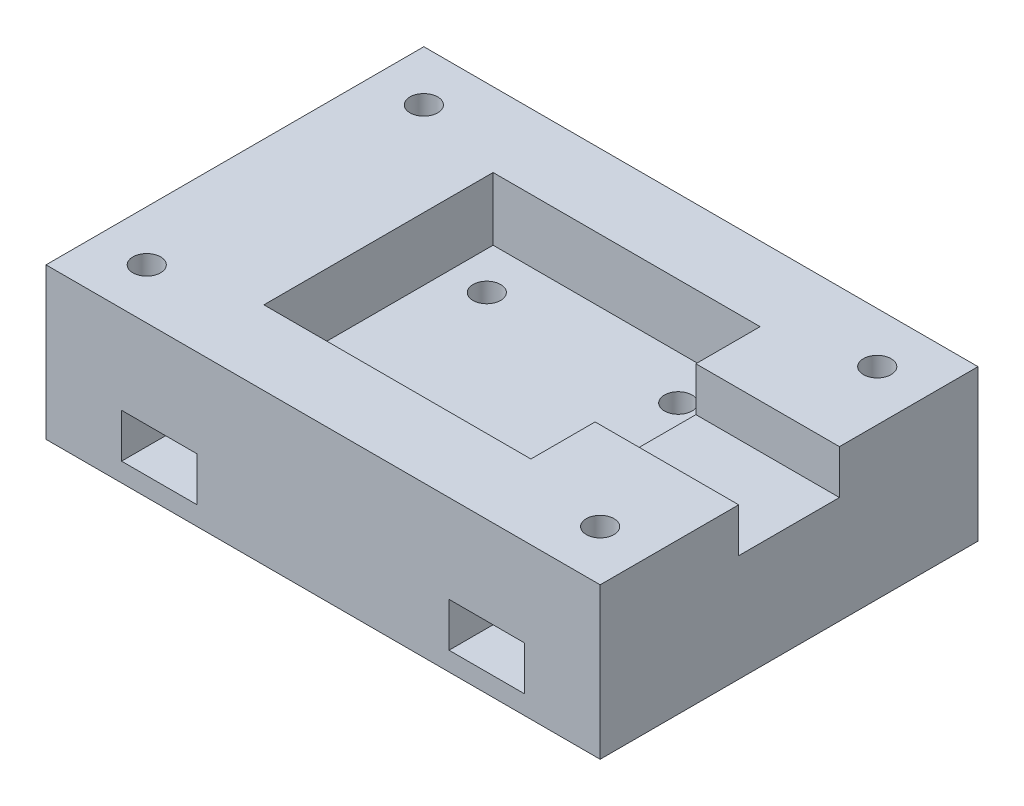
ISO-10303-21;
HEADER;
FILE_DESCRIPTION(('STEP AP214'),'2;1');
FILE_NAME('part.step','',(''),(''),'','','');
FILE_SCHEMA(('AUTOMOTIVE_DESIGN { 1 0 10303 214 1 1 1 1 }'));
ENDSEC;
DATA;
#1=APPLICATION_CONTEXT('core data for automotive mechanical design processes');
#2=APPLICATION_PROTOCOL_DEFINITION('international standard','automotive_design',2000,#1);
#3=PRODUCT_CONTEXT('',#1,'mechanical');
#4=PRODUCT('Part','Part','',(#3));
#5=PRODUCT_RELATED_PRODUCT_CATEGORY('part','',(#4));
#6=PRODUCT_DEFINITION_FORMATION('','',#4);
#7=PRODUCT_DEFINITION_CONTEXT('part definition',#1,'design');
#8=PRODUCT_DEFINITION('design','',#6,#7);
#9=PRODUCT_DEFINITION_SHAPE('','',#8);
#10=(LENGTH_UNIT() NAMED_UNIT(*) SI_UNIT(.MILLI.,.METRE.));
#11=(NAMED_UNIT(*) PLANE_ANGLE_UNIT() SI_UNIT($,.RADIAN.));
#12=(NAMED_UNIT(*) SI_UNIT($,.STERADIAN.) SOLID_ANGLE_UNIT());
#13=UNCERTAINTY_MEASURE_WITH_UNIT(LENGTH_MEASURE(1.E-05),#10,'distance_accuracy_value','');
#14=(GEOMETRIC_REPRESENTATION_CONTEXT(3) GLOBAL_UNCERTAINTY_ASSIGNED_CONTEXT((#13)) GLOBAL_UNIT_ASSIGNED_CONTEXT((#10,
#11,#12)) REPRESENTATION_CONTEXT('',''));
#15=CARTESIAN_POINT('',(0.,0.,0.));
#16=DIRECTION('',(0.,0.,1.));
#17=DIRECTION('',(1.,0.,0.));
#18=AXIS2_PLACEMENT_3D('',#15,#16,#17);
#19=CARTESIAN_POINT('',(22.,12.,15.));
#20=DIRECTION('',(-1.,0.,0.));
#21=DIRECTION('',(0.,0.,1.));
#22=AXIS2_PLACEMENT_3D('',#19,#20,#21);
#23=PLANE('',#22);
#24=DIRECTION('',(0.,0.,-1.));
#25=VECTOR('',#24,1.);
#26=CARTESIAN_POINT('',(22.,12.,15.));
#27=LINE('',#26,#25);
#28=CARTESIAN_POINT('',(22.,12.,-4.));
#29=VERTEX_POINT('',#28);
#30=CARTESIAN_POINT('',(22.,12.,-15.));
#31=VERTEX_POINT('',#30);
#32=EDGE_CURVE('E334',#29,#31,#27,.T.);
#33=ORIENTED_EDGE('',*,*,#32,.F.);
#34=DIRECTION('',(0.,-1.,0.));
#35=VECTOR('',#34,1.);
#36=CARTESIAN_POINT('',(22.,12.,-4.));
#37=LINE('',#36,#35);
#38=CARTESIAN_POINT('',(22.,8.5,-4.));
#39=VERTEX_POINT('',#38);
#40=EDGE_CURVE('E261',#29,#39,#37,.T.);
#41=ORIENTED_EDGE('',*,*,#40,.T.);
#42=DIRECTION('',(0.,0.,1.));
#43=VECTOR('',#42,1.);
#44=CARTESIAN_POINT('',(22.,8.5,15.));
#45=LINE('',#44,#43);
#46=CARTESIAN_POINT('',(22.,8.5,4.));
#47=VERTEX_POINT('',#46);
#48=EDGE_CURVE('E253',#39,#47,#45,.T.);
#49=ORIENTED_EDGE('',*,*,#48,.T.);
#50=DIRECTION('',(0.,1.,0.));
#51=VECTOR('',#50,1.);
#52=CARTESIAN_POINT('',(22.,12.,4.));
#53=LINE('',#52,#51);
#54=CARTESIAN_POINT('',(22.,12.,4.));
#55=VERTEX_POINT('',#54);
#56=EDGE_CURVE('E258',#47,#55,#53,.T.);
#57=ORIENTED_EDGE('',*,*,#56,.T.);
#58=CARTESIAN_POINT('',(22.,12.,15.));
#59=VERTEX_POINT('',#58);
#60=EDGE_CURVE('E330',#59,#55,#27,.T.);
#61=ORIENTED_EDGE('',*,*,#60,.F.);
#62=DIRECTION('',(0.,-1.,0.));
#63=VECTOR('',#62,1.);
#64=CARTESIAN_POINT('',(22.,12.,15.));
#65=LINE('',#64,#63);
#66=CARTESIAN_POINT('',(22.,0.,15.));
#67=VERTEX_POINT('',#66);
#68=EDGE_CURVE('E340',#59,#67,#65,.T.);
#69=ORIENTED_EDGE('',*,*,#68,.T.);
#70=DIRECTION('',(0.,0.,-1.));
#71=VECTOR('',#70,1.);
#72=CARTESIAN_POINT('',(22.,0.,15.));
#73=LINE('',#72,#71);
#74=CARTESIAN_POINT('',(22.,0.,-15.));
#75=VERTEX_POINT('',#74);
#76=EDGE_CURVE('E323',#67,#75,#73,.T.);
#77=ORIENTED_EDGE('',*,*,#76,.T.);
#78=DIRECTION('',(0.,-1.,0.));
#79=VECTOR('',#78,1.);
#80=CARTESIAN_POINT('',(22.,12.,-15.));
#81=LINE('',#80,#79);
#82=EDGE_CURVE('E357',#31,#75,#81,.T.);
#83=ORIENTED_EDGE('',*,*,#82,.F.);
#84=EDGE_LOOP('',(#33,#41,#49,#57,#61,#69,#77,#83));
#85=FACE_BOUND('',#84,.T.);
#86=ADVANCED_FACE('F41',(#85),#23,.F.);
#87=CARTESIAN_POINT('',(-22.,12.,-15.));
#88=DIRECTION('',(0.,0.,1.));
#89=DIRECTION('',(1.,0.,0.));
#90=AXIS2_PLACEMENT_3D('',#87,#88,#89);
#91=PLANE('',#90);
#92=DIRECTION('',(-1.,0.,0.));
#93=VECTOR('',#92,1.);
#94=CARTESIAN_POINT('',(-16.,5.,-15.));
#95=LINE('',#94,#93);
#96=CARTESIAN_POINT('',(-10.,5.,-15.));
#97=VERTEX_POINT('',#96);
#98=CARTESIAN_POINT('',(-16.,5.,-15.));
#99=VERTEX_POINT('',#98);
#100=EDGE_CURVE('E209',#97,#99,#95,.T.);
#101=ORIENTED_EDGE('',*,*,#100,.T.);
#102=DIRECTION('',(0.,-1.,0.));
#103=VECTOR('',#102,1.);
#104=CARTESIAN_POINT('',(-16.,1.5,-15.));
#105=LINE('',#104,#103);
#106=CARTESIAN_POINT('',(-16.,1.5,-15.));
#107=VERTEX_POINT('',#106);
#108=EDGE_CURVE('E200',#99,#107,#105,.T.);
#109=ORIENTED_EDGE('',*,*,#108,.T.);
#110=DIRECTION('',(1.,0.,0.));
#111=VECTOR('',#110,1.);
#112=CARTESIAN_POINT('',(-16.,1.5,-15.));
#113=LINE('',#112,#111);
#114=CARTESIAN_POINT('',(-10.,1.5,-15.));
#115=VERTEX_POINT('',#114);
#116=EDGE_CURVE('E206',#107,#115,#113,.T.);
#117=ORIENTED_EDGE('',*,*,#116,.T.);
#118=DIRECTION('',(0.,1.,0.));
#119=VECTOR('',#118,1.);
#120=CARTESIAN_POINT('',(-10.,1.5,-15.));
#121=LINE('',#120,#119);
#122=EDGE_CURVE('E55',#115,#97,#121,.T.);
#123=ORIENTED_EDGE('',*,*,#122,.T.);
#124=EDGE_LOOP('',(#101,#109,#117,#123));
#125=FACE_BOUND('',#124,.T.);
#126=DIRECTION('',(-1.,0.,0.));
#127=VECTOR('',#126,1.);
#128=CARTESIAN_POINT('',(10.,5.,-15.));
#129=LINE('',#128,#127);
#130=CARTESIAN_POINT('',(16.,5.,-15.));
#131=VERTEX_POINT('',#130);
#132=CARTESIAN_POINT('',(10.,5.,-15.));
#133=VERTEX_POINT('',#132);
#134=EDGE_CURVE('E220',#131,#133,#129,.T.);
#135=ORIENTED_EDGE('',*,*,#134,.T.);
#136=DIRECTION('',(0.,-1.,0.));
#137=VECTOR('',#136,1.);
#138=CARTESIAN_POINT('',(10.,1.5,-15.));
#139=LINE('',#138,#137);
#140=CARTESIAN_POINT('',(10.,1.5,-15.));
#141=VERTEX_POINT('',#140);
#142=EDGE_CURVE('E233',#133,#141,#139,.T.);
#143=ORIENTED_EDGE('',*,*,#142,.T.);
#144=DIRECTION('',(1.,0.,0.));
#145=VECTOR('',#144,1.);
#146=CARTESIAN_POINT('',(10.,1.5,-15.));
#147=LINE('',#146,#145);
#148=CARTESIAN_POINT('',(16.,1.5,-15.));
#149=VERTEX_POINT('',#148);
#150=EDGE_CURVE('E230',#141,#149,#147,.T.);
#151=ORIENTED_EDGE('',*,*,#150,.T.);
#152=DIRECTION('',(0.,1.,0.));
#153=VECTOR('',#152,1.);
#154=CARTESIAN_POINT('',(16.,1.5,-15.));
#155=LINE('',#154,#153);
#156=EDGE_CURVE('E63',#149,#131,#155,.T.);
#157=ORIENTED_EDGE('',*,*,#156,.T.);
#158=EDGE_LOOP('',(#135,#143,#151,#157));
#159=FACE_BOUND('',#158,.T.);
#160=DIRECTION('',(-1.,0.,0.));
#161=VECTOR('',#160,1.);
#162=CARTESIAN_POINT('',(-22.,0.,-15.));
#163=LINE('',#162,#161);
#164=CARTESIAN_POINT('',(-22.,0.,-15.));
#165=VERTEX_POINT('',#164);
#166=EDGE_CURVE('E343',#75,#165,#163,.T.);
#167=ORIENTED_EDGE('',*,*,#166,.T.);
#168=DIRECTION('',(0.,-1.,0.));
#169=VECTOR('',#168,1.);
#170=CARTESIAN_POINT('',(-22.,12.,-15.));
#171=LINE('',#170,#169);
#172=CARTESIAN_POINT('',(-22.,12.,-15.));
#173=VERTEX_POINT('',#172);
#174=EDGE_CURVE('E354',#173,#165,#171,.T.);
#175=ORIENTED_EDGE('',*,*,#174,.F.);
#176=DIRECTION('',(-1.,0.,0.));
#177=VECTOR('',#176,1.);
#178=CARTESIAN_POINT('',(-22.,12.,-15.));
#179=LINE('',#178,#177);
#180=EDGE_CURVE('E333',#31,#173,#179,.T.);
#181=ORIENTED_EDGE('',*,*,#180,.F.);
#182=ORIENTED_EDGE('',*,*,#82,.T.);
#183=EDGE_LOOP('',(#167,#175,#181,#182));
#184=FACE_BOUND('',#183,.T.);
#185=ADVANCED_FACE('F415',(#125,#159,#184),#91,.F.);
#186=CARTESIAN_POINT('',(-22.,12.,15.));
#187=DIRECTION('',(1.,0.,0.));
#188=DIRECTION('',(0.,0.,-1.));
#189=AXIS2_PLACEMENT_3D('',#186,#187,#188);
#190=PLANE('',#189);
#191=DIRECTION('',(0.,0.,1.));
#192=VECTOR('',#191,1.);
#193=CARTESIAN_POINT('',(-22.,0.,15.));
#194=LINE('',#193,#192);
#195=CARTESIAN_POINT('',(-22.,0.,15.));
#196=VERTEX_POINT('',#195);
#197=EDGE_CURVE('E345',#165,#196,#194,.T.);
#198=ORIENTED_EDGE('',*,*,#197,.T.);
#199=DIRECTION('',(0.,-1.,0.));
#200=VECTOR('',#199,1.);
#201=CARTESIAN_POINT('',(-22.,12.,15.));
#202=LINE('',#201,#200);
#203=CARTESIAN_POINT('',(-22.,12.,15.));
#204=VERTEX_POINT('',#203);
#205=EDGE_CURVE('E351',#204,#196,#202,.T.);
#206=ORIENTED_EDGE('',*,*,#205,.F.);
#207=DIRECTION('',(0.,0.,1.));
#208=VECTOR('',#207,1.);
#209=CARTESIAN_POINT('',(-22.,12.,15.));
#210=LINE('',#209,#208);
#211=EDGE_CURVE('E336',#173,#204,#210,.T.);
#212=ORIENTED_EDGE('',*,*,#211,.F.);
#213=ORIENTED_EDGE('',*,*,#174,.T.);
#214=EDGE_LOOP('',(#198,#206,#212,#213));
#215=FACE_BOUND('',#214,.T.);
#216=ADVANCED_FACE('F421',(#215),#190,.F.);
#217=CARTESIAN_POINT('',(-22.,12.,15.));
#218=DIRECTION('',(0.,0.,-1.));
#219=DIRECTION('',(-1.,0.,0.));
#220=AXIS2_PLACEMENT_3D('',#217,#218,#219);
#221=PLANE('',#220);
#222=DIRECTION('',(1.,0.,0.));
#223=VECTOR('',#222,1.);
#224=CARTESIAN_POINT('',(-16.,1.5,15.));
#225=LINE('',#224,#223);
#226=CARTESIAN_POINT('',(-16.,1.5,15.));
#227=VERTEX_POINT('',#226);
#228=CARTESIAN_POINT('',(-10.,1.5,15.));
#229=VERTEX_POINT('',#228);
#230=EDGE_CURVE('E189',#227,#229,#225,.T.);
#231=ORIENTED_EDGE('',*,*,#230,.F.);
#232=DIRECTION('',(0.,-1.,0.));
#233=VECTOR('',#232,1.);
#234=CARTESIAN_POINT('',(-16.,1.5,15.));
#235=LINE('',#234,#233);
#236=CARTESIAN_POINT('',(-16.,5.,15.));
#237=VERTEX_POINT('',#236);
#238=EDGE_CURVE('E193',#237,#227,#235,.T.);
#239=ORIENTED_EDGE('',*,*,#238,.F.);
#240=DIRECTION('',(-1.,0.,0.));
#241=VECTOR('',#240,1.);
#242=CARTESIAN_POINT('',(-16.,5.,15.));
#243=LINE('',#242,#241);
#244=CARTESIAN_POINT('',(-10.,5.,15.));
#245=VERTEX_POINT('',#244);
#246=EDGE_CURVE('E198',#245,#237,#243,.T.);
#247=ORIENTED_EDGE('',*,*,#246,.F.);
#248=DIRECTION('',(0.,1.,0.));
#249=VECTOR('',#248,1.);
#250=CARTESIAN_POINT('',(-10.,1.5,15.));
#251=LINE('',#250,#249);
#252=EDGE_CURVE('E179',#229,#245,#251,.T.);
#253=ORIENTED_EDGE('',*,*,#252,.F.);
#254=EDGE_LOOP('',(#231,#239,#247,#253));
#255=FACE_BOUND('',#254,.T.);
#256=DIRECTION('',(1.,0.,0.));
#257=VECTOR('',#256,1.);
#258=CARTESIAN_POINT('',(10.,1.5,15.));
#259=LINE('',#258,#257);
#260=CARTESIAN_POINT('',(10.,1.5,15.));
#261=VERTEX_POINT('',#260);
#262=CARTESIAN_POINT('',(16.,1.5,15.));
#263=VERTEX_POINT('',#262);
#264=EDGE_CURVE('E242',#261,#263,#259,.T.);
#265=ORIENTED_EDGE('',*,*,#264,.F.);
#266=DIRECTION('',(0.,-1.,0.));
#267=VECTOR('',#266,1.);
#268=CARTESIAN_POINT('',(10.,1.5,15.));
#269=LINE('',#268,#267);
#270=CARTESIAN_POINT('',(10.,5.,15.));
#271=VERTEX_POINT('',#270);
#272=EDGE_CURVE('E245',#271,#261,#269,.T.);
#273=ORIENTED_EDGE('',*,*,#272,.F.);
#274=DIRECTION('',(-1.,0.,0.));
#275=VECTOR('',#274,1.);
#276=CARTESIAN_POINT('',(10.,5.,15.));
#277=LINE('',#276,#275);
#278=CARTESIAN_POINT('',(16.,5.,15.));
#279=VERTEX_POINT('',#278);
#280=EDGE_CURVE('E236',#279,#271,#277,.T.);
#281=ORIENTED_EDGE('',*,*,#280,.F.);
#282=DIRECTION('',(0.,1.,0.));
#283=VECTOR('',#282,1.);
#284=CARTESIAN_POINT('',(16.,1.5,15.));
#285=LINE('',#284,#283);
#286=EDGE_CURVE('E239',#263,#279,#285,.T.);
#287=ORIENTED_EDGE('',*,*,#286,.F.);
#288=EDGE_LOOP('',(#265,#273,#281,#287));
#289=FACE_BOUND('',#288,.T.);
#290=DIRECTION('',(1.,0.,0.));
#291=VECTOR('',#290,1.);
#292=CARTESIAN_POINT('',(-22.,0.,15.));
#293=LINE('',#292,#291);
#294=EDGE_CURVE('E347',#196,#67,#293,.T.);
#295=ORIENTED_EDGE('',*,*,#294,.T.);
#296=ORIENTED_EDGE('',*,*,#68,.F.);
#297=DIRECTION('',(1.,0.,0.));
#298=VECTOR('',#297,1.);
#299=CARTESIAN_POINT('',(-22.,12.,15.));
#300=LINE('',#299,#298);
#301=EDGE_CURVE('E338',#204,#59,#300,.T.);
#302=ORIENTED_EDGE('',*,*,#301,.F.);
#303=ORIENTED_EDGE('',*,*,#205,.T.);
#304=EDGE_LOOP('',(#295,#296,#302,#303));
#305=FACE_BOUND('',#304,.T.);
#306=ADVANCED_FACE('F195',(#255,#289,#305),#221,.F.);
#307=CARTESIAN_POINT('',(0.,12.,0.));
#308=DIRECTION('',(0.,-1.,0.));
#309=DIRECTION('',(0.,0.,-1.));
#310=AXIS2_PLACEMENT_3D('',#307,#308,#309);
#311=PLANE('',#310);
#312=CARTESIAN_POINT('',(-18.,12.,-11.));
#313=DIRECTION('',(0.,1.,0.));
#314=DIRECTION('',(0.,0.,1.));
#315=AXIS2_PLACEMENT_3D('',#312,#313,#314);
#316=CIRCLE('',#315,1.1);
#317=CARTESIAN_POINT('',(-18.,12.,-9.9));
#318=VERTEX_POINT('',#317);
#319=EDGE_CURVE('E271',#318,#318,#316,.T.);
#320=ORIENTED_EDGE('',*,*,#319,.F.);
#321=EDGE_LOOP('',(#320));
#322=FACE_BOUND('',#321,.T.);
#323=CARTESIAN_POINT('',(18.,12.,11.));
#324=DIRECTION('',(0.,1.,0.));
#325=DIRECTION('',(0.,0.,1.));
#326=AXIS2_PLACEMENT_3D('',#323,#324,#325);
#327=CIRCLE('',#326,1.1);
#328=CARTESIAN_POINT('',(18.,12.,12.1));
#329=VERTEX_POINT('',#328);
#330=EDGE_CURVE('E278',#329,#329,#327,.T.);
#331=ORIENTED_EDGE('',*,*,#330,.F.);
#332=EDGE_LOOP('',(#331));
#333=FACE_BOUND('',#332,.T.);
#334=CARTESIAN_POINT('',(18.,12.,-11.));
#335=DIRECTION('',(0.,1.,0.));
#336=DIRECTION('',(0.,0.,1.));
#337=AXIS2_PLACEMENT_3D('',#334,#335,#336);
#338=CIRCLE('',#337,1.1);
#339=CARTESIAN_POINT('',(18.,12.,-9.9));
#340=VERTEX_POINT('',#339);
#341=EDGE_CURVE('E265',#340,#340,#338,.T.);
#342=ORIENTED_EDGE('',*,*,#341,.F.);
#343=EDGE_LOOP('',(#342));
#344=FACE_BOUND('',#343,.T.);
#345=CARTESIAN_POINT('',(-18.,12.,11.));
#346=DIRECTION('',(0.,1.,0.));
#347=DIRECTION('',(0.,0.,1.));
#348=AXIS2_PLACEMENT_3D('',#345,#346,#347);
#349=CIRCLE('',#348,1.1);
#350=CARTESIAN_POINT('',(-18.,12.,12.1));
#351=VERTEX_POINT('',#350);
#352=EDGE_CURVE('E274',#351,#351,#349,.T.);
#353=ORIENTED_EDGE('',*,*,#352,.F.);
#354=EDGE_LOOP('',(#353));
#355=FACE_BOUND('',#354,.T.);
#356=DIRECTION('',(0.,0.,-1.));
#357=VECTOR('',#356,1.);
#358=CARTESIAN_POINT('',(10.6,12.,9.1));
#359=LINE('',#358,#357);
#360=CARTESIAN_POINT('',(10.6,12.,-4.));
#361=VERTEX_POINT('',#360);
#362=CARTESIAN_POINT('',(10.6,12.,-9.1));
#363=VERTEX_POINT('',#362);
#364=EDGE_CURVE('E313',#361,#363,#359,.T.);
#365=ORIENTED_EDGE('',*,*,#364,.F.);
#366=DIRECTION('',(-1.,0.,0.));
#367=VECTOR('',#366,1.);
#368=CARTESIAN_POINT('',(10.35,12.,-4.));
#369=LINE('',#368,#367);
#370=EDGE_CURVE('E251',#29,#361,#369,.T.);
#371=ORIENTED_EDGE('',*,*,#370,.F.);
#372=ORIENTED_EDGE('',*,*,#32,.T.);
#373=ORIENTED_EDGE('',*,*,#180,.T.);
#374=ORIENTED_EDGE('',*,*,#211,.T.);
#375=ORIENTED_EDGE('',*,*,#301,.T.);
#376=ORIENTED_EDGE('',*,*,#60,.T.);
#377=DIRECTION('',(1.,0.,0.));
#378=VECTOR('',#377,1.);
#379=CARTESIAN_POINT('',(10.35,12.,4.));
#380=LINE('',#379,#378);
#381=CARTESIAN_POINT('',(10.6,12.,4.));
#382=VERTEX_POINT('',#381);
#383=EDGE_CURVE('E214',#382,#55,#380,.T.);
#384=ORIENTED_EDGE('',*,*,#383,.F.);
#385=CARTESIAN_POINT('',(10.6,12.,9.1));
#386=VERTEX_POINT('',#385);
#387=EDGE_CURVE('E309',#386,#382,#359,.T.);
#388=ORIENTED_EDGE('',*,*,#387,.F.);
#389=DIRECTION('',(1.,0.,0.));
#390=VECTOR('',#389,1.);
#391=CARTESIAN_POINT('',(-10.6,12.,9.1));
#392=LINE('',#391,#390);
#393=CARTESIAN_POINT('',(-10.6,12.,9.1));
#394=VERTEX_POINT('',#393);
#395=EDGE_CURVE('E299',#394,#386,#392,.T.);
#396=ORIENTED_EDGE('',*,*,#395,.F.);
#397=DIRECTION('',(0.,0.,1.));
#398=VECTOR('',#397,1.);
#399=CARTESIAN_POINT('',(-10.6,12.,9.1));
#400=LINE('',#399,#398);
#401=CARTESIAN_POINT('',(-10.6,12.,-9.1));
#402=VERTEX_POINT('',#401);
#403=EDGE_CURVE('E316',#402,#394,#400,.T.);
#404=ORIENTED_EDGE('',*,*,#403,.F.);
#405=DIRECTION('',(-1.,0.,0.));
#406=VECTOR('',#405,1.);
#407=CARTESIAN_POINT('',(-10.6,12.,-9.1));
#408=LINE('',#407,#406);
#409=EDGE_CURVE('E312',#363,#402,#408,.T.);
#410=ORIENTED_EDGE('',*,*,#409,.F.);
#411=EDGE_LOOP('',(#365,#371,#372,#373,#374,#375,#376,#384,#388,#396,#404,#410));
#412=FACE_BOUND('',#411,.T.);
#413=ADVANCED_FACE('F377',(#322,#333,#344,#355,#412),#311,.F.);
#414=CARTESIAN_POINT('',(0.,0.,0.));
#415=DIRECTION('',(0.,-1.,0.));
#416=DIRECTION('',(0.,0.,-1.));
#417=AXIS2_PLACEMENT_3D('',#414,#415,#416);
#418=PLANE('',#417);
#419=ORIENTED_EDGE('',*,*,#76,.F.);
#420=ORIENTED_EDGE('',*,*,#294,.F.);
#421=ORIENTED_EDGE('',*,*,#197,.F.);
#422=ORIENTED_EDGE('',*,*,#166,.F.);
#423=EDGE_LOOP('',(#419,#420,#421,#422));
#424=FACE_BOUND('',#423,.T.);
#425=ADVANCED_FACE('F433',(#424),#418,.T.);
#426=CARTESIAN_POINT('',(10.6,7.,9.1));
#427=DIRECTION('',(1.,0.,0.));
#428=DIRECTION('',(0.,0.,-1.));
#429=AXIS2_PLACEMENT_3D('',#426,#427,#428);
#430=PLANE('',#429);
#431=DIRECTION('',(0.,0.,-1.));
#432=VECTOR('',#431,1.);
#433=CARTESIAN_POINT('',(10.6,8.5,9.1));
#434=LINE('',#433,#432);
#435=CARTESIAN_POINT('',(10.6,8.5,4.));
#436=VERTEX_POINT('',#435);
#437=CARTESIAN_POINT('',(10.6,8.5,-4.));
#438=VERTEX_POINT('',#437);
#439=EDGE_CURVE('E360',#436,#438,#434,.T.);
#440=ORIENTED_EDGE('',*,*,#439,.T.);
#441=DIRECTION('',(0.,1.,0.));
#442=VECTOR('',#441,1.);
#443=CARTESIAN_POINT('',(10.6,7.,-4.));
#444=LINE('',#443,#442);
#445=EDGE_CURVE('E11',#438,#361,#444,.T.);
#446=ORIENTED_EDGE('',*,*,#445,.T.);
#447=ORIENTED_EDGE('',*,*,#364,.T.);
#448=DIRECTION('',(0.,1.,0.));
#449=VECTOR('',#448,1.);
#450=CARTESIAN_POINT('',(10.6,7.,-9.1));
#451=LINE('',#450,#449);
#452=CARTESIAN_POINT('',(10.6,7.,-9.1));
#453=VERTEX_POINT('',#452);
#454=EDGE_CURVE('E308',#453,#363,#451,.T.);
#455=ORIENTED_EDGE('',*,*,#454,.F.);
#456=DIRECTION('',(0.,0.,-1.));
#457=VECTOR('',#456,1.);
#458=CARTESIAN_POINT('',(10.6,7.,9.1));
#459=LINE('',#458,#457);
#460=CARTESIAN_POINT('',(10.6,7.,9.1));
#461=VERTEX_POINT('',#460);
#462=EDGE_CURVE('E295',#461,#453,#459,.T.);
#463=ORIENTED_EDGE('',*,*,#462,.F.);
#464=DIRECTION('',(0.,1.,0.));
#465=VECTOR('',#464,1.);
#466=CARTESIAN_POINT('',(10.6,7.,9.1));
#467=LINE('',#466,#465);
#468=EDGE_CURVE('E321',#461,#386,#467,.T.);
#469=ORIENTED_EDGE('',*,*,#468,.T.);
#470=ORIENTED_EDGE('',*,*,#387,.T.);
#471=DIRECTION('',(0.,-1.,0.));
#472=VECTOR('',#471,1.);
#473=CARTESIAN_POINT('',(10.6,7.,4.));
#474=LINE('',#473,#472);
#475=EDGE_CURVE('E48',#382,#436,#474,.T.);
#476=ORIENTED_EDGE('',*,*,#475,.T.);
#477=EDGE_LOOP('',(#440,#446,#447,#455,#463,#469,#470,#476));
#478=FACE_BOUND('',#477,.T.);
#479=ADVANCED_FACE('F369',(#478),#430,.F.);
#480=CARTESIAN_POINT('',(-10.6,7.,9.1));
#481=DIRECTION('',(0.,0.,1.));
#482=DIRECTION('',(1.,0.,0.));
#483=AXIS2_PLACEMENT_3D('',#480,#481,#482);
#484=PLANE('',#483);
#485=ORIENTED_EDGE('',*,*,#395,.T.);
#486=ORIENTED_EDGE('',*,*,#468,.F.);
#487=DIRECTION('',(1.,0.,0.));
#488=VECTOR('',#487,1.);
#489=CARTESIAN_POINT('',(-10.6,7.,9.1));
#490=LINE('',#489,#488);
#491=CARTESIAN_POINT('',(-10.6,7.,9.1));
#492=VERTEX_POINT('',#491);
#493=EDGE_CURVE('E305',#492,#461,#490,.T.);
#494=ORIENTED_EDGE('',*,*,#493,.F.);
#495=DIRECTION('',(0.,1.,0.));
#496=VECTOR('',#495,1.);
#497=CARTESIAN_POINT('',(-10.6,7.,9.1));
#498=LINE('',#497,#496);
#499=EDGE_CURVE('E324',#492,#394,#498,.T.);
#500=ORIENTED_EDGE('',*,*,#499,.T.);
#501=EDGE_LOOP('',(#485,#486,#494,#500));
#502=FACE_BOUND('',#501,.T.);
#503=ADVANCED_FACE('F403',(#502),#484,.F.);
#504=CARTESIAN_POINT('',(-10.6,7.,9.1));
#505=DIRECTION('',(-1.,0.,0.));
#506=DIRECTION('',(0.,0.,1.));
#507=AXIS2_PLACEMENT_3D('',#504,#505,#506);
#508=PLANE('',#507);
#509=ORIENTED_EDGE('',*,*,#403,.T.);
#510=ORIENTED_EDGE('',*,*,#499,.F.);
#511=DIRECTION('',(0.,0.,1.));
#512=VECTOR('',#511,1.);
#513=CARTESIAN_POINT('',(-10.6,7.,9.1));
#514=LINE('',#513,#512);
#515=CARTESIAN_POINT('',(-10.6,7.,-9.1));
#516=VERTEX_POINT('',#515);
#517=EDGE_CURVE('E302',#516,#492,#514,.T.);
#518=ORIENTED_EDGE('',*,*,#517,.F.);
#519=DIRECTION('',(0.,1.,0.));
#520=VECTOR('',#519,1.);
#521=CARTESIAN_POINT('',(-10.6,7.,-9.1));
#522=LINE('',#521,#520);
#523=EDGE_CURVE('E326',#516,#402,#522,.T.);
#524=ORIENTED_EDGE('',*,*,#523,.T.);
#525=EDGE_LOOP('',(#509,#510,#518,#524));
#526=FACE_BOUND('',#525,.T.);
#527=ADVANCED_FACE('F405',(#526),#508,.F.);
#528=CARTESIAN_POINT('',(-10.6,7.,-9.1));
#529=DIRECTION('',(0.,0.,-1.));
#530=DIRECTION('',(-1.,0.,0.));
#531=AXIS2_PLACEMENT_3D('',#528,#529,#530);
#532=PLANE('',#531);
#533=ORIENTED_EDGE('',*,*,#409,.T.);
#534=ORIENTED_EDGE('',*,*,#523,.F.);
#535=DIRECTION('',(-1.,0.,0.));
#536=VECTOR('',#535,1.);
#537=CARTESIAN_POINT('',(-10.6,7.,-9.1));
#538=LINE('',#537,#536);
#539=EDGE_CURVE('E298',#453,#516,#538,.T.);
#540=ORIENTED_EDGE('',*,*,#539,.F.);
#541=ORIENTED_EDGE('',*,*,#454,.T.);
#542=EDGE_LOOP('',(#533,#534,#540,#541));
#543=FACE_BOUND('',#542,.T.);
#544=ADVANCED_FACE('F395',(#543),#532,.F.);
#545=CARTESIAN_POINT('',(0.,7.,0.));
#546=DIRECTION('',(0.,-1.,0.));
#547=DIRECTION('',(0.,0.,-1.));
#548=AXIS2_PLACEMENT_3D('',#545,#546,#547);
#549=PLANE('',#548);
#550=CARTESIAN_POINT('',(-7.6,7.,-5.6));
#551=DIRECTION('',(0.,-1.,0.));
#552=DIRECTION('',(0.,0.,-1.));
#553=AXIS2_PLACEMENT_3D('',#550,#551,#552);
#554=CIRCLE('',#553,1.1);
#555=CARTESIAN_POINT('',(-7.6,7.,-6.7));
#556=VERTEX_POINT('',#555);
#557=EDGE_CURVE('E363',#556,#556,#554,.T.);
#558=ORIENTED_EDGE('',*,*,#557,.T.);
#559=EDGE_LOOP('',(#558));
#560=FACE_BOUND('',#559,.T.);
#561=CARTESIAN_POINT('',(7.6,7.,-5.6));
#562=DIRECTION('',(0.,-1.,0.));
#563=DIRECTION('',(0.,0.,-1.));
#564=AXIS2_PLACEMENT_3D('',#561,#562,#563);
#565=CIRCLE('',#564,1.1);
#566=CARTESIAN_POINT('',(7.6,7.,-6.7));
#567=VERTEX_POINT('',#566);
#568=EDGE_CURVE('E292',#567,#567,#565,.T.);
#569=ORIENTED_EDGE('',*,*,#568,.T.);
#570=EDGE_LOOP('',(#569));
#571=FACE_BOUND('',#570,.T.);
#572=ORIENTED_EDGE('',*,*,#462,.T.);
#573=ORIENTED_EDGE('',*,*,#539,.T.);
#574=ORIENTED_EDGE('',*,*,#517,.T.);
#575=ORIENTED_EDGE('',*,*,#493,.T.);
#576=EDGE_LOOP('',(#572,#573,#574,#575));
#577=FACE_BOUND('',#576,.T.);
#578=ADVANCED_FACE('F401',(#560,#571,#577),#549,.F.);
#579=CARTESIAN_POINT('',(7.6,3.,-5.6));
#580=DIRECTION('',(0.,1.,0.));
#581=DIRECTION('',(0.,0.,1.));
#582=AXIS2_PLACEMENT_3D('',#579,#580,#581);
#583=CYLINDRICAL_SURFACE('',#582,1.1);
#584=CARTESIAN_POINT('',(7.6,3.,-5.6));
#585=DIRECTION('',(0.,1.,0.));
#586=DIRECTION('',(0.,0.,1.));
#587=AXIS2_PLACEMENT_3D('',#584,#585,#586);
#588=CIRCLE('',#587,1.1);
#589=CARTESIAN_POINT('',(7.6,3.,-4.5));
#590=VERTEX_POINT('',#589);
#591=EDGE_CURVE('E286',#590,#590,#588,.T.);
#592=ORIENTED_EDGE('',*,*,#591,.F.);
#593=EDGE_LOOP('',(#592));
#594=FACE_BOUND('',#593,.T.);
#595=ORIENTED_EDGE('',*,*,#568,.F.);
#596=EDGE_LOOP('',(#595));
#597=FACE_BOUND('',#596,.T.);
#598=ADVANCED_FACE('F587',(#594,#597),#583,.F.);
#599=CARTESIAN_POINT('',(7.6,3.,-5.6));
#600=DIRECTION('',(0.,1.,0.));
#601=DIRECTION('',(0.,0.,1.));
#602=AXIS2_PLACEMENT_3D('',#599,#600,#601);
#603=PLANE('',#602);
#604=ORIENTED_EDGE('',*,*,#591,.T.);
#605=EDGE_LOOP('',(#604));
#606=FACE_BOUND('',#605,.T.);
#607=ADVANCED_FACE('F585',(#606),#603,.T.);
#608=CARTESIAN_POINT('',(-7.6,3.,-5.6));
#609=DIRECTION('',(0.,1.,0.));
#610=DIRECTION('',(0.,0.,1.));
#611=AXIS2_PLACEMENT_3D('',#608,#609,#610);
#612=CYLINDRICAL_SURFACE('',#611,1.1);
#613=CARTESIAN_POINT('',(-7.6,3.,-5.6));
#614=DIRECTION('',(0.,1.,0.));
#615=DIRECTION('',(0.,0.,1.));
#616=AXIS2_PLACEMENT_3D('',#613,#614,#615);
#617=CIRCLE('',#616,1.1);
#618=CARTESIAN_POINT('',(-7.6,3.,-4.5));
#619=VERTEX_POINT('',#618);
#620=EDGE_CURVE('E289',#619,#619,#617,.T.);
#621=ORIENTED_EDGE('',*,*,#620,.F.);
#622=EDGE_LOOP('',(#621));
#623=FACE_BOUND('',#622,.T.);
#624=ORIENTED_EDGE('',*,*,#557,.F.);
#625=EDGE_LOOP('',(#624));
#626=FACE_BOUND('',#625,.T.);
#627=ADVANCED_FACE('F581',(#623,#626),#612,.F.);
#628=CARTESIAN_POINT('',(-7.6,3.,-5.6));
#629=DIRECTION('',(0.,1.,0.));
#630=DIRECTION('',(0.,0.,1.));
#631=AXIS2_PLACEMENT_3D('',#628,#629,#630);
#632=PLANE('',#631);
#633=ORIENTED_EDGE('',*,*,#620,.T.);
#634=EDGE_LOOP('',(#633));
#635=FACE_BOUND('',#634,.T.);
#636=ADVANCED_FACE('F577',(#635),#632,.T.);
#637=CARTESIAN_POINT('',(-18.,4.,11.));
#638=DIRECTION('',(0.,1.,0.));
#639=DIRECTION('',(0.,0.,1.));
#640=AXIS2_PLACEMENT_3D('',#637,#638,#639);
#641=CYLINDRICAL_SURFACE('',#640,1.1);
#642=CARTESIAN_POINT('',(-18.,4.,11.));
#643=DIRECTION('',(0.,1.,0.));
#644=DIRECTION('',(0.,0.,1.));
#645=AXIS2_PLACEMENT_3D('',#642,#643,#644);
#646=CIRCLE('',#645,1.1);
#647=CARTESIAN_POINT('',(-18.,4.,12.1));
#648=VERTEX_POINT('',#647);
#649=EDGE_CURVE('E283',#648,#648,#646,.T.);
#650=ORIENTED_EDGE('',*,*,#649,.F.);
#651=EDGE_LOOP('',(#650));
#652=FACE_BOUND('',#651,.T.);
#653=ORIENTED_EDGE('',*,*,#352,.T.);
#654=EDGE_LOOP('',(#653));
#655=FACE_BOUND('',#654,.T.);
#656=ADVANCED_FACE('F573',(#652,#655),#641,.F.);
#657=CARTESIAN_POINT('',(-18.,4.,11.));
#658=DIRECTION('',(0.,1.,0.));
#659=DIRECTION('',(0.,0.,1.));
#660=AXIS2_PLACEMENT_3D('',#657,#658,#659);
#661=PLANE('',#660);
#662=ORIENTED_EDGE('',*,*,#649,.T.);
#663=EDGE_LOOP('',(#662));
#664=FACE_BOUND('',#663,.T.);
#665=ADVANCED_FACE('F552',(#664),#661,.T.);
#666=CARTESIAN_POINT('',(18.,4.,-11.));
#667=DIRECTION('',(0.,1.,0.));
#668=DIRECTION('',(0.,0.,1.));
#669=AXIS2_PLACEMENT_3D('',#666,#667,#668);
#670=CYLINDRICAL_SURFACE('',#669,1.1);
#671=CARTESIAN_POINT('',(18.,4.,-11.));
#672=DIRECTION('',(0.,1.,0.));
#673=DIRECTION('',(0.,0.,1.));
#674=AXIS2_PLACEMENT_3D('',#671,#672,#673);
#675=CIRCLE('',#674,1.1);
#676=CARTESIAN_POINT('',(18.,4.,-9.9));
#677=VERTEX_POINT('',#676);
#678=EDGE_CURVE('E264',#677,#677,#675,.T.);
#679=ORIENTED_EDGE('',*,*,#678,.F.);
#680=EDGE_LOOP('',(#679));
#681=FACE_BOUND('',#680,.T.);
#682=ORIENTED_EDGE('',*,*,#341,.T.);
#683=EDGE_LOOP('',(#682));
#684=FACE_BOUND('',#683,.T.);
#685=ADVANCED_FACE('F548',(#681,#684),#670,.F.);
#686=CARTESIAN_POINT('',(18.,4.,-11.));
#687=DIRECTION('',(0.,1.,0.));
#688=DIRECTION('',(0.,0.,1.));
#689=AXIS2_PLACEMENT_3D('',#686,#687,#688);
#690=PLANE('',#689);
#691=ORIENTED_EDGE('',*,*,#678,.T.);
#692=EDGE_LOOP('',(#691));
#693=FACE_BOUND('',#692,.T.);
#694=ADVANCED_FACE('F551',(#693),#690,.T.);
#695=CARTESIAN_POINT('',(18.,4.,11.));
#696=DIRECTION('',(0.,1.,0.));
#697=DIRECTION('',(0.,0.,1.));
#698=AXIS2_PLACEMENT_3D('',#695,#696,#697);
#699=CYLINDRICAL_SURFACE('',#698,1.1);
#700=CARTESIAN_POINT('',(18.,4.,11.));
#701=DIRECTION('',(0.,1.,0.));
#702=DIRECTION('',(0.,0.,1.));
#703=AXIS2_PLACEMENT_3D('',#700,#701,#702);
#704=CIRCLE('',#703,1.1);
#705=CARTESIAN_POINT('',(18.,4.,12.1));
#706=VERTEX_POINT('',#705);
#707=EDGE_CURVE('E268',#706,#706,#704,.T.);
#708=ORIENTED_EDGE('',*,*,#707,.F.);
#709=EDGE_LOOP('',(#708));
#710=FACE_BOUND('',#709,.T.);
#711=ORIENTED_EDGE('',*,*,#330,.T.);
#712=EDGE_LOOP('',(#711));
#713=FACE_BOUND('',#712,.T.);
#714=ADVANCED_FACE('F556',(#710,#713),#699,.F.);
#715=CARTESIAN_POINT('',(18.,4.,11.));
#716=DIRECTION('',(0.,1.,0.));
#717=DIRECTION('',(0.,0.,1.));
#718=AXIS2_PLACEMENT_3D('',#715,#716,#717);
#719=PLANE('',#718);
#720=ORIENTED_EDGE('',*,*,#707,.T.);
#721=EDGE_LOOP('',(#720));
#722=FACE_BOUND('',#721,.T.);
#723=ADVANCED_FACE('F561',(#722),#719,.T.);
#724=CARTESIAN_POINT('',(-18.,4.,-11.));
#725=DIRECTION('',(0.,1.,0.));
#726=DIRECTION('',(0.,0.,1.));
#727=AXIS2_PLACEMENT_3D('',#724,#725,#726);
#728=CYLINDRICAL_SURFACE('',#727,1.1);
#729=CARTESIAN_POINT('',(-18.,4.,-11.));
#730=DIRECTION('',(0.,1.,0.));
#731=DIRECTION('',(0.,0.,1.));
#732=AXIS2_PLACEMENT_3D('',#729,#730,#731);
#733=CIRCLE('',#732,1.1);
#734=CARTESIAN_POINT('',(-18.,4.,-9.9));
#735=VERTEX_POINT('',#734);
#736=EDGE_CURVE('E275',#735,#735,#733,.T.);
#737=ORIENTED_EDGE('',*,*,#736,.F.);
#738=EDGE_LOOP('',(#737));
#739=FACE_BOUND('',#738,.T.);
#740=ORIENTED_EDGE('',*,*,#319,.T.);
#741=EDGE_LOOP('',(#740));
#742=FACE_BOUND('',#741,.T.);
#743=ADVANCED_FACE('F558',(#739,#742),#728,.F.);
#744=CARTESIAN_POINT('',(-18.,4.,-11.));
#745=DIRECTION('',(0.,1.,0.));
#746=DIRECTION('',(0.,0.,1.));
#747=AXIS2_PLACEMENT_3D('',#744,#745,#746);
#748=PLANE('',#747);
#749=ORIENTED_EDGE('',*,*,#736,.T.);
#750=EDGE_LOOP('',(#749));
#751=FACE_BOUND('',#750,.T.);
#752=ADVANCED_FACE('F453',(#751),#748,.T.);
#753=CARTESIAN_POINT('',(10.35,8.5,-4.));
#754=DIRECTION('',(0.,0.,-1.));
#755=DIRECTION('',(-1.,0.,0.));
#756=AXIS2_PLACEMENT_3D('',#753,#754,#755);
#757=PLANE('',#756);
#758=ORIENTED_EDGE('',*,*,#370,.T.);
#759=ORIENTED_EDGE('',*,*,#445,.F.);
#760=DIRECTION('',(-1.,0.,0.));
#761=VECTOR('',#760,1.);
#762=CARTESIAN_POINT('',(10.35,8.5,-4.));
#763=LINE('',#762,#761);
#764=EDGE_CURVE('E250',#39,#438,#763,.T.);
#765=ORIENTED_EDGE('',*,*,#764,.F.);
#766=ORIENTED_EDGE('',*,*,#40,.F.);
#767=EDGE_LOOP('',(#758,#759,#765,#766));
#768=FACE_BOUND('',#767,.T.);
#769=ADVANCED_FACE('F390',(#768),#757,.F.);
#770=CARTESIAN_POINT('',(10.35,8.5,4.));
#771=DIRECTION('',(0.,0.,1.));
#772=DIRECTION('',(1.,0.,0.));
#773=AXIS2_PLACEMENT_3D('',#770,#771,#772);
#774=PLANE('',#773);
#775=DIRECTION('',(1.,0.,0.));
#776=VECTOR('',#775,1.);
#777=CARTESIAN_POINT('',(10.35,8.5,4.));
#778=LINE('',#777,#776);
#779=EDGE_CURVE('E247',#436,#47,#778,.T.);
#780=ORIENTED_EDGE('',*,*,#779,.F.);
#781=ORIENTED_EDGE('',*,*,#475,.F.);
#782=ORIENTED_EDGE('',*,*,#383,.T.);
#783=ORIENTED_EDGE('',*,*,#56,.F.);
#784=EDGE_LOOP('',(#780,#781,#782,#783));
#785=FACE_BOUND('',#784,.T.);
#786=ADVANCED_FACE('F374',(#785),#774,.F.);
#787=CARTESIAN_POINT('',(0.,8.5,0.));
#788=DIRECTION('',(0.,-1.,0.));
#789=DIRECTION('',(0.,0.,-1.));
#790=AXIS2_PLACEMENT_3D('',#787,#788,#789);
#791=PLANE('',#790);
#792=ORIENTED_EDGE('',*,*,#764,.T.);
#793=ORIENTED_EDGE('',*,*,#439,.F.);
#794=ORIENTED_EDGE('',*,*,#779,.T.);
#795=ORIENTED_EDGE('',*,*,#48,.F.);
#796=EDGE_LOOP('',(#792,#793,#794,#795));
#797=FACE_BOUND('',#796,.T.);
#798=ADVANCED_FACE('F386',(#797),#791,.F.);
#799=CARTESIAN_POINT('',(10.,1.5,-15.));
#800=DIRECTION('',(-1.,0.,0.));
#801=DIRECTION('',(0.,0.,1.));
#802=AXIS2_PLACEMENT_3D('',#799,#800,#801);
#803=PLANE('',#802);
#804=DIRECTION('',(0.,0.,1.));
#805=VECTOR('',#804,1.);
#806=CARTESIAN_POINT('',(10.,1.5,-15.));
#807=LINE('',#806,#805);
#808=EDGE_CURVE('E217',#141,#261,#807,.T.);
#809=ORIENTED_EDGE('',*,*,#808,.F.);
#810=ORIENTED_EDGE('',*,*,#142,.F.);
#811=DIRECTION('',(0.,0.,1.));
#812=VECTOR('',#811,1.);
#813=CARTESIAN_POINT('',(10.,5.,-15.));
#814=LINE('',#813,#812);
#815=EDGE_CURVE('E225',#133,#271,#814,.T.);
#816=ORIENTED_EDGE('',*,*,#815,.T.);
#817=ORIENTED_EDGE('',*,*,#272,.T.);
#818=EDGE_LOOP('',(#809,#810,#816,#817));
#819=FACE_BOUND('',#818,.T.);
#820=ADVANCED_FACE('F467',(#819),#803,.F.);
#821=CARTESIAN_POINT('',(10.,5.,-15.));
#822=DIRECTION('',(0.,1.,0.));
#823=DIRECTION('',(0.,0.,1.));
#824=AXIS2_PLACEMENT_3D('',#821,#822,#823);
#825=PLANE('',#824);
#826=ORIENTED_EDGE('',*,*,#815,.F.);
#827=ORIENTED_EDGE('',*,*,#134,.F.);
#828=DIRECTION('',(0.,0.,1.));
#829=VECTOR('',#828,1.);
#830=CARTESIAN_POINT('',(16.,5.,-15.));
#831=LINE('',#830,#829);
#832=EDGE_CURVE('E223',#131,#279,#831,.T.);
#833=ORIENTED_EDGE('',*,*,#832,.T.);
#834=ORIENTED_EDGE('',*,*,#280,.T.);
#835=EDGE_LOOP('',(#826,#827,#833,#834));
#836=FACE_BOUND('',#835,.T.);
#837=ADVANCED_FACE('F479',(#836),#825,.F.);
#838=CARTESIAN_POINT('',(16.,1.5,-15.));
#839=DIRECTION('',(1.,0.,0.));
#840=DIRECTION('',(0.,0.,-1.));
#841=AXIS2_PLACEMENT_3D('',#838,#839,#840);
#842=PLANE('',#841);
#843=ORIENTED_EDGE('',*,*,#832,.F.);
#844=ORIENTED_EDGE('',*,*,#156,.F.);
#845=DIRECTION('',(0.,0.,1.));
#846=VECTOR('',#845,1.);
#847=CARTESIAN_POINT('',(16.,1.5,-15.));
#848=LINE('',#847,#846);
#849=EDGE_CURVE('E221',#149,#263,#848,.T.);
#850=ORIENTED_EDGE('',*,*,#849,.T.);
#851=ORIENTED_EDGE('',*,*,#286,.T.);
#852=EDGE_LOOP('',(#843,#844,#850,#851));
#853=FACE_BOUND('',#852,.T.);
#854=ADVANCED_FACE('F489',(#853),#842,.F.);
#855=CARTESIAN_POINT('',(10.,1.5,-15.));
#856=DIRECTION('',(0.,-1.,0.));
#857=DIRECTION('',(0.,0.,-1.));
#858=AXIS2_PLACEMENT_3D('',#855,#856,#857);
#859=PLANE('',#858);
#860=ORIENTED_EDGE('',*,*,#849,.F.);
#861=ORIENTED_EDGE('',*,*,#150,.F.);
#862=ORIENTED_EDGE('',*,*,#808,.T.);
#863=ORIENTED_EDGE('',*,*,#264,.T.);
#864=EDGE_LOOP('',(#860,#861,#862,#863));
#865=FACE_BOUND('',#864,.T.);
#866=ADVANCED_FACE('F499',(#865),#859,.F.);
#867=CARTESIAN_POINT('',(-16.,1.5,-15.));
#868=DIRECTION('',(-1.,0.,0.));
#869=DIRECTION('',(0.,0.,1.));
#870=AXIS2_PLACEMENT_3D('',#867,#868,#869);
#871=PLANE('',#870);
#872=DIRECTION('',(0.,0.,1.));
#873=VECTOR('',#872,1.);
#874=CARTESIAN_POINT('',(-16.,1.5,-15.));
#875=LINE('',#874,#873);
#876=EDGE_CURVE('E185',#107,#227,#875,.T.);
#877=ORIENTED_EDGE('',*,*,#876,.F.);
#878=ORIENTED_EDGE('',*,*,#108,.F.);
#879=DIRECTION('',(0.,0.,1.));
#880=VECTOR('',#879,1.);
#881=CARTESIAN_POINT('',(-16.,5.,-15.));
#882=LINE('',#881,#880);
#883=EDGE_CURVE('E212',#99,#237,#882,.T.);
#884=ORIENTED_EDGE('',*,*,#883,.T.);
#885=ORIENTED_EDGE('',*,*,#238,.T.);
#886=EDGE_LOOP('',(#877,#878,#884,#885));
#887=FACE_BOUND('',#886,.T.);
#888=ADVANCED_FACE('F508',(#887),#871,.F.);
#889=CARTESIAN_POINT('',(-16.,5.,-15.));
#890=DIRECTION('',(0.,1.,0.));
#891=DIRECTION('',(0.,0.,1.));
#892=AXIS2_PLACEMENT_3D('',#889,#890,#891);
#893=PLANE('',#892);
#894=ORIENTED_EDGE('',*,*,#883,.F.);
#895=ORIENTED_EDGE('',*,*,#100,.F.);
#896=DIRECTION('',(0.,0.,1.));
#897=VECTOR('',#896,1.);
#898=CARTESIAN_POINT('',(-10.,5.,-15.));
#899=LINE('',#898,#897);
#900=EDGE_CURVE('E184',#97,#245,#899,.T.);
#901=ORIENTED_EDGE('',*,*,#900,.T.);
#902=ORIENTED_EDGE('',*,*,#246,.T.);
#903=EDGE_LOOP('',(#894,#895,#901,#902));
#904=FACE_BOUND('',#903,.T.);
#905=ADVANCED_FACE('F518',(#904),#893,.F.);
#906=CARTESIAN_POINT('',(-10.,1.5,-15.));
#907=DIRECTION('',(1.,0.,0.));
#908=DIRECTION('',(0.,0.,-1.));
#909=AXIS2_PLACEMENT_3D('',#906,#907,#908);
#910=PLANE('',#909);
#911=ORIENTED_EDGE('',*,*,#900,.F.);
#912=ORIENTED_EDGE('',*,*,#122,.F.);
#913=DIRECTION('',(0.,0.,1.));
#914=VECTOR('',#913,1.);
#915=CARTESIAN_POINT('',(-10.,1.5,-15.));
#916=LINE('',#915,#914);
#917=EDGE_CURVE('E175',#115,#229,#916,.T.);
#918=ORIENTED_EDGE('',*,*,#917,.T.);
#919=ORIENTED_EDGE('',*,*,#252,.T.);
#920=EDGE_LOOP('',(#911,#912,#918,#919));
#921=FACE_BOUND('',#920,.T.);
#922=ADVANCED_FACE('F177',(#921),#910,.F.);
#923=CARTESIAN_POINT('',(-16.,1.5,-15.));
#924=DIRECTION('',(0.,-1.,0.));
#925=DIRECTION('',(0.,0.,-1.));
#926=AXIS2_PLACEMENT_3D('',#923,#924,#925);
#927=PLANE('',#926);
#928=ORIENTED_EDGE('',*,*,#917,.F.);
#929=ORIENTED_EDGE('',*,*,#116,.F.);
#930=ORIENTED_EDGE('',*,*,#876,.T.);
#931=ORIENTED_EDGE('',*,*,#230,.T.);
#932=EDGE_LOOP('',(#928,#929,#930,#931));
#933=FACE_BOUND('',#932,.T.);
#934=ADVANCED_FACE('F190',(#933),#927,.F.);
#935=CLOSED_SHELL('',(#86,#185,#216,#306,#413,#425,#479,#503,#527,#544,#578,#598,#607,#627,#636,
#656,#665,#685,#694,#714,#723,#743,#752,#769,#786,#798,#820,#837,#854,#866,#888,#905,#922,#934));
#936=MANIFOLD_SOLID_BREP('B2',#935);
#937=ADVANCED_BREP_SHAPE_REPRESENTATION('',(#18,#936),#14);
#938=SHAPE_DEFINITION_REPRESENTATION(#9,#937);
ENDSEC;
END-ISO-10303-21;
